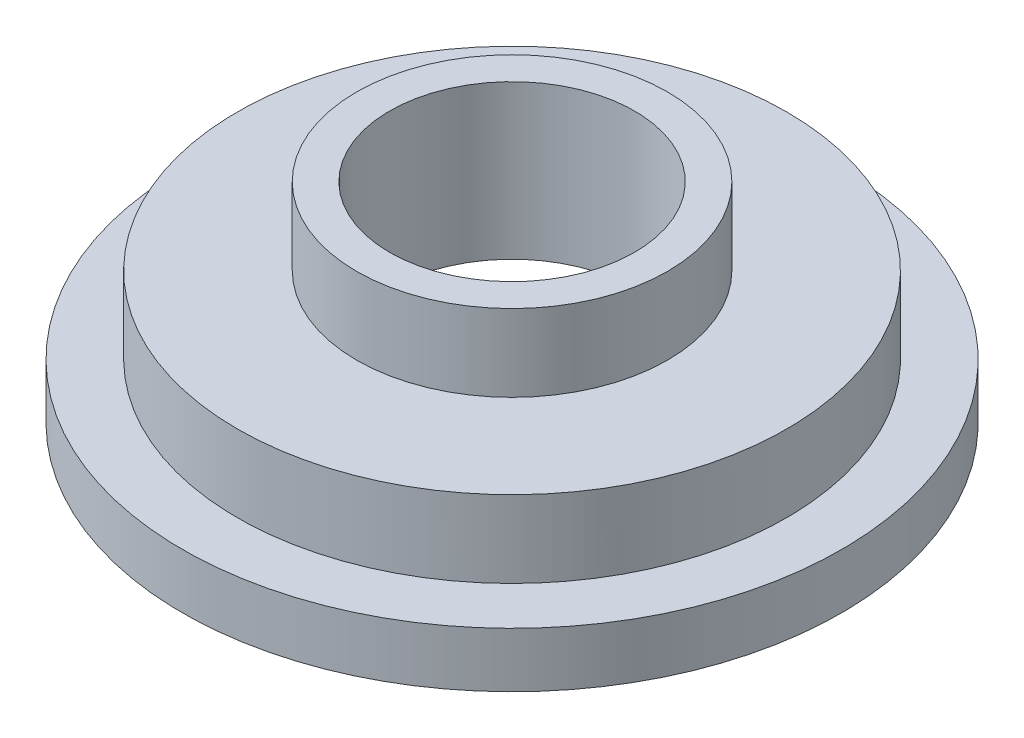
ISO-10303-21;
HEADER;
FILE_DESCRIPTION(('STEP AP214'),'2;1');
FILE_NAME('part.step','',(''),(''),'','','');
FILE_SCHEMA(('AUTOMOTIVE_DESIGN { 1 0 10303 214 1 1 1 1 }'));
ENDSEC;
DATA;
#1=APPLICATION_CONTEXT('core data for automotive mechanical design processes');
#2=APPLICATION_PROTOCOL_DEFINITION('international standard','automotive_design',2000,#1);
#3=PRODUCT_CONTEXT('',#1,'mechanical');
#4=PRODUCT('Part','Part','',(#3));
#5=PRODUCT_RELATED_PRODUCT_CATEGORY('part','',(#4));
#6=PRODUCT_DEFINITION_FORMATION('','',#4);
#7=PRODUCT_DEFINITION_CONTEXT('part definition',#1,'design');
#8=PRODUCT_DEFINITION('design','',#6,#7);
#9=PRODUCT_DEFINITION_SHAPE('','',#8);
#10=(LENGTH_UNIT() NAMED_UNIT(*) SI_UNIT(.MILLI.,.METRE.));
#11=(NAMED_UNIT(*) PLANE_ANGLE_UNIT() SI_UNIT($,.RADIAN.));
#12=(NAMED_UNIT(*) SI_UNIT($,.STERADIAN.) SOLID_ANGLE_UNIT());
#13=UNCERTAINTY_MEASURE_WITH_UNIT(LENGTH_MEASURE(1.E-05),#10,'distance_accuracy_value','');
#14=(GEOMETRIC_REPRESENTATION_CONTEXT(3) GLOBAL_UNCERTAINTY_ASSIGNED_CONTEXT((#13)) GLOBAL_UNIT_ASSIGNED_CONTEXT((#10,
#11,#12)) REPRESENTATION_CONTEXT('',''));
#15=CARTESIAN_POINT('',(0.,0.,0.));
#16=DIRECTION('',(0.,0.,1.));
#17=DIRECTION('',(1.,0.,0.));
#18=AXIS2_PLACEMENT_3D('',#15,#16,#17);
#19=CARTESIAN_POINT('',(0.,0.,0.));
#20=DIRECTION('',(0.,1.,0.));
#21=DIRECTION('',(0.,0.,1.));
#22=AXIS2_PLACEMENT_3D('',#19,#20,#21);
#23=PLANE('',#22);
#24=CARTESIAN_POINT('',(0.,0.,0.));
#25=DIRECTION('',(0.,1.,0.));
#26=DIRECTION('',(0.,0.,1.));
#27=AXIS2_PLACEMENT_3D('',#24,#25,#26);
#28=CIRCLE('',#27,11.15);
#29=CARTESIAN_POINT('',(0.,0.,11.15));
#30=VERTEX_POINT('',#29);
#31=EDGE_CURVE('E51',#30,#30,#28,.T.);
#32=ORIENTED_EDGE('',*,*,#31,.T.);
#33=EDGE_LOOP('',(#32));
#34=FACE_BOUND('',#33,.T.);
#35=CARTESIAN_POINT('',(0.,0.,0.));
#36=DIRECTION('',(0.,-1.,0.));
#37=DIRECTION('',(0.,0.,-1.));
#38=AXIS2_PLACEMENT_3D('',#35,#36,#37);
#39=CIRCLE('',#38,20.);
#40=CARTESIAN_POINT('',(0.,0.,-20.));
#41=VERTEX_POINT('',#40);
#42=EDGE_CURVE('E84',#41,#41,#39,.T.);
#43=ORIENTED_EDGE('',*,*,#42,.T.);
#44=EDGE_LOOP('',(#43));
#45=FACE_BOUND('',#44,.T.);
#46=ADVANCED_FACE('F43',(#34,#45),#23,.F.);
#47=CARTESIAN_POINT('',(0.,7.,0.));
#48=DIRECTION('',(0.,1.,0.));
#49=DIRECTION('',(0.,0.,1.));
#50=AXIS2_PLACEMENT_3D('',#47,#48,#49);
#51=PLANE('',#50);
#52=CARTESIAN_POINT('',(0.,7.,0.));
#53=DIRECTION('',(0.,1.,0.));
#54=DIRECTION('',(0.,0.,1.));
#55=AXIS2_PLACEMENT_3D('',#52,#53,#54);
#56=CIRCLE('',#55,25.);
#57=CARTESIAN_POINT('',(0.,7.,25.));
#58=VERTEX_POINT('',#57);
#59=EDGE_CURVE('E10',#58,#58,#56,.T.);
#60=ORIENTED_EDGE('',*,*,#59,.T.);
#61=EDGE_LOOP('',(#60));
#62=FACE_BOUND('',#61,.T.);
#63=CARTESIAN_POINT('',(0.,7.,0.));
#64=DIRECTION('',(0.,1.,0.));
#65=DIRECTION('',(0.,0.,1.));
#66=AXIS2_PLACEMENT_3D('',#63,#64,#65);
#67=CIRCLE('',#66,14.15);
#68=CARTESIAN_POINT('',(0.,7.,14.15));
#69=VERTEX_POINT('',#68);
#70=EDGE_CURVE('E61',#69,#69,#67,.T.);
#71=ORIENTED_EDGE('',*,*,#70,.F.);
#72=EDGE_LOOP('',(#71));
#73=FACE_BOUND('',#72,.T.);
#74=ADVANCED_FACE('F113',(#62,#73),#51,.T.);
#75=CARTESIAN_POINT('',(0.,7.,0.));
#76=DIRECTION('',(0.,-1.,0.));
#77=DIRECTION('',(0.,0.,-1.));
#78=AXIS2_PLACEMENT_3D('',#75,#76,#77);
#79=CYLINDRICAL_SURFACE('',#78,25.);
#80=ORIENTED_EDGE('',*,*,#59,.F.);
#81=EDGE_LOOP('',(#80));
#82=FACE_BOUND('',#81,.T.);
#83=CARTESIAN_POINT('',(0.,0.,0.));
#84=DIRECTION('',(0.,-1.,0.));
#85=DIRECTION('',(0.,0.,-1.));
#86=AXIS2_PLACEMENT_3D('',#83,#84,#85);
#87=CIRCLE('',#86,25.);
#88=CARTESIAN_POINT('',(0.,0.,-25.));
#89=VERTEX_POINT('',#88);
#90=EDGE_CURVE('E71',#89,#89,#87,.T.);
#91=ORIENTED_EDGE('',*,*,#90,.F.);
#92=EDGE_LOOP('',(#91));
#93=FACE_BOUND('',#92,.T.);
#94=ADVANCED_FACE('F45',(#82,#93),#79,.T.);
#95=CARTESIAN_POINT('',(0.,7.,0.));
#96=DIRECTION('',(0.,-1.,0.));
#97=DIRECTION('',(0.,0.,-1.));
#98=AXIS2_PLACEMENT_3D('',#95,#96,#97);
#99=CYLINDRICAL_SURFACE('',#98,11.15);
#100=ORIENTED_EDGE('',*,*,#31,.F.);
#101=EDGE_LOOP('',(#100));
#102=FACE_BOUND('',#101,.T.);
#103=CARTESIAN_POINT('',(0.,14.,0.));
#104=DIRECTION('',(0.,1.,0.));
#105=DIRECTION('',(0.,0.,1.));
#106=AXIS2_PLACEMENT_3D('',#103,#104,#105);
#107=CIRCLE('',#106,11.15);
#108=CARTESIAN_POINT('',(0.,14.,11.15));
#109=VERTEX_POINT('',#108);
#110=EDGE_CURVE('E66',#109,#109,#107,.T.);
#111=ORIENTED_EDGE('',*,*,#110,.T.);
#112=EDGE_LOOP('',(#111));
#113=FACE_BOUND('',#112,.T.);
#114=ADVANCED_FACE('F120',(#102,#113),#99,.F.);
#115=CARTESIAN_POINT('',(0.,14.,0.));
#116=DIRECTION('',(0.,1.,0.));
#117=DIRECTION('',(0.,0.,1.));
#118=AXIS2_PLACEMENT_3D('',#115,#116,#117);
#119=PLANE('',#118);
#120=CARTESIAN_POINT('',(0.,14.,0.));
#121=DIRECTION('',(0.,1.,0.));
#122=DIRECTION('',(0.,0.,1.));
#123=AXIS2_PLACEMENT_3D('',#120,#121,#122);
#124=CIRCLE('',#123,14.15);
#125=CARTESIAN_POINT('',(0.,14.,14.15));
#126=VERTEX_POINT('',#125);
#127=EDGE_CURVE('E56',#126,#126,#124,.T.);
#128=ORIENTED_EDGE('',*,*,#127,.T.);
#129=EDGE_LOOP('',(#128));
#130=FACE_BOUND('',#129,.T.);
#131=ORIENTED_EDGE('',*,*,#110,.F.);
#132=EDGE_LOOP('',(#131));
#133=FACE_BOUND('',#132,.T.);
#134=ADVANCED_FACE('F109',(#130,#133),#119,.T.);
#135=CARTESIAN_POINT('',(0.,14.,0.));
#136=DIRECTION('',(0.,-1.,0.));
#137=DIRECTION('',(0.,0.,-1.));
#138=AXIS2_PLACEMENT_3D('',#135,#136,#137);
#139=CYLINDRICAL_SURFACE('',#138,14.15);
#140=ORIENTED_EDGE('',*,*,#127,.F.);
#141=EDGE_LOOP('',(#140));
#142=FACE_BOUND('',#141,.T.);
#143=ORIENTED_EDGE('',*,*,#70,.T.);
#144=EDGE_LOOP('',(#143));
#145=FACE_BOUND('',#144,.T.);
#146=ADVANCED_FACE('F98',(#142,#145),#139,.T.);
#147=CARTESIAN_POINT('',(0.,-5.,0.));
#148=DIRECTION('',(0.,-1.,0.));
#149=DIRECTION('',(0.,0.,-1.));
#150=AXIS2_PLACEMENT_3D('',#147,#148,#149);
#151=PLANE('',#150);
#152=CARTESIAN_POINT('',(0.,-5.,0.));
#153=DIRECTION('',(0.,-1.,0.));
#154=DIRECTION('',(0.,0.,-1.));
#155=AXIS2_PLACEMENT_3D('',#152,#153,#154);
#156=CIRCLE('',#155,30.);
#157=CARTESIAN_POINT('',(0.,-5.,-30.));
#158=VERTEX_POINT('',#157);
#159=EDGE_CURVE('E75',#158,#158,#156,.T.);
#160=ORIENTED_EDGE('',*,*,#159,.T.);
#161=EDGE_LOOP('',(#160));
#162=FACE_BOUND('',#161,.T.);
#163=CARTESIAN_POINT('',(0.,-5.,0.));
#164=DIRECTION('',(0.,-1.,0.));
#165=DIRECTION('',(0.,0.,-1.));
#166=AXIS2_PLACEMENT_3D('',#163,#164,#165);
#167=CIRCLE('',#166,20.);
#168=CARTESIAN_POINT('',(0.,-5.,-20.));
#169=VERTEX_POINT('',#168);
#170=EDGE_CURVE('E80',#169,#169,#167,.T.);
#171=ORIENTED_EDGE('',*,*,#170,.F.);
#172=EDGE_LOOP('',(#171));
#173=FACE_BOUND('',#172,.T.);
#174=ADVANCED_FACE('F95',(#162,#173),#151,.T.);
#175=CARTESIAN_POINT('',(0.,0.,0.));
#176=DIRECTION('',(0.,-1.,0.));
#177=DIRECTION('',(0.,0.,-1.));
#178=AXIS2_PLACEMENT_3D('',#175,#176,#177);
#179=PLANE('',#178);
#180=ORIENTED_EDGE('',*,*,#90,.T.);
#181=EDGE_LOOP('',(#180));
#182=FACE_BOUND('',#181,.T.);
#183=CARTESIAN_POINT('',(0.,0.,0.));
#184=DIRECTION('',(0.,-1.,0.));
#185=DIRECTION('',(0.,0.,-1.));
#186=AXIS2_PLACEMENT_3D('',#183,#184,#185);
#187=CIRCLE('',#186,30.);
#188=CARTESIAN_POINT('',(0.,0.,-30.));
#189=VERTEX_POINT('',#188);
#190=EDGE_CURVE('E76',#189,#189,#187,.T.);
#191=ORIENTED_EDGE('',*,*,#190,.F.);
#192=EDGE_LOOP('',(#191));
#193=FACE_BOUND('',#192,.T.);
#194=ADVANCED_FACE('F97',(#182,#193),#179,.F.);
#195=CARTESIAN_POINT('',(0.,-5.,0.));
#196=DIRECTION('',(0.,1.,0.));
#197=DIRECTION('',(0.,0.,1.));
#198=AXIS2_PLACEMENT_3D('',#195,#196,#197);
#199=CYLINDRICAL_SURFACE('',#198,30.);
#200=ORIENTED_EDGE('',*,*,#159,.F.);
#201=EDGE_LOOP('',(#200));
#202=FACE_BOUND('',#201,.T.);
#203=ORIENTED_EDGE('',*,*,#190,.T.);
#204=EDGE_LOOP('',(#203));
#205=FACE_BOUND('',#204,.T.);
#206=ADVANCED_FACE('F105',(#202,#205),#199,.T.);
#207=CARTESIAN_POINT('',(0.,-5.,0.));
#208=DIRECTION('',(0.,1.,0.));
#209=DIRECTION('',(0.,0.,1.));
#210=AXIS2_PLACEMENT_3D('',#207,#208,#209);
#211=CYLINDRICAL_SURFACE('',#210,20.);
#212=ORIENTED_EDGE('',*,*,#170,.T.);
#213=EDGE_LOOP('',(#212));
#214=FACE_BOUND('',#213,.T.);
#215=ORIENTED_EDGE('',*,*,#42,.F.);
#216=EDGE_LOOP('',(#215));
#217=FACE_BOUND('',#216,.T.);
#218=ADVANCED_FACE('F92',(#214,#217),#211,.F.);
#219=CLOSED_SHELL('',(#46,#74,#94,#114,#134,#146,#174,#194,#206,#218));
#220=MANIFOLD_SOLID_BREP('B2',#219);
#221=ADVANCED_BREP_SHAPE_REPRESENTATION('',(#18,#220),#14);
#222=SHAPE_DEFINITION_REPRESENTATION(#9,#221);
ENDSEC;
END-ISO-10303-21;
